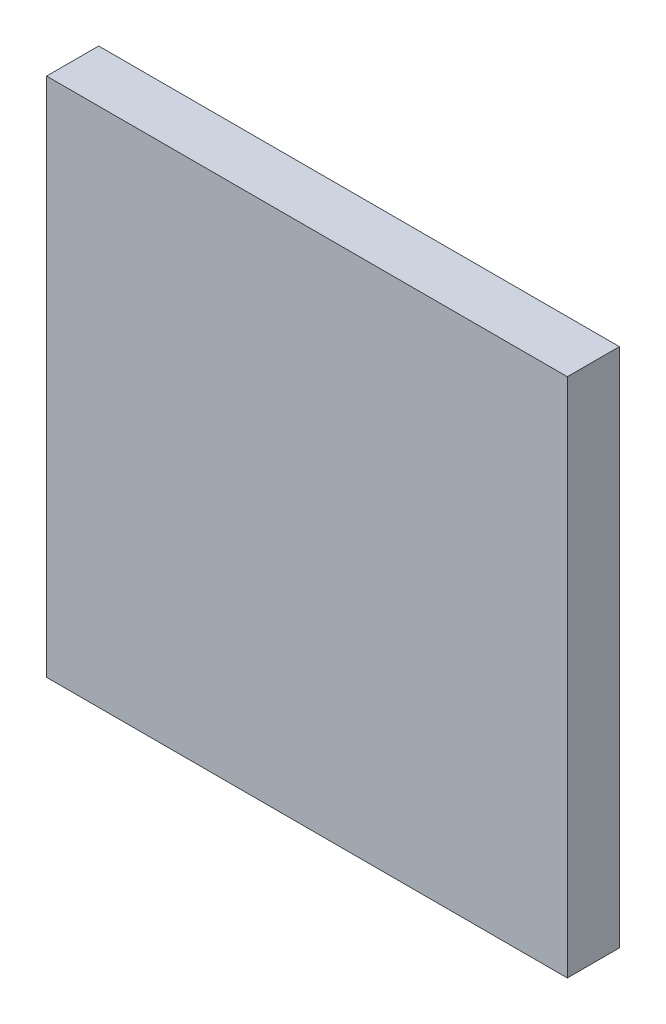
ISO-10303-21;
HEADER;
FILE_DESCRIPTION(('STEP AP214'),'2;1');
FILE_NAME('part.step','',(''),(''),'','','');
FILE_SCHEMA(('AUTOMOTIVE_DESIGN { 1 0 10303 214 1 1 1 1 }'));
ENDSEC;
DATA;
#1=APPLICATION_CONTEXT('core data for automotive mechanical design processes');
#2=APPLICATION_PROTOCOL_DEFINITION('international standard','automotive_design',2000,#1);
#3=PRODUCT_CONTEXT('',#1,'mechanical');
#4=PRODUCT('Part','Part','',(#3));
#5=PRODUCT_RELATED_PRODUCT_CATEGORY('part','',(#4));
#6=PRODUCT_DEFINITION_FORMATION('','',#4);
#7=PRODUCT_DEFINITION_CONTEXT('part definition',#1,'design');
#8=PRODUCT_DEFINITION('design','',#6,#7);
#9=PRODUCT_DEFINITION_SHAPE('','',#8);
#10=(LENGTH_UNIT() NAMED_UNIT(*) SI_UNIT(.MILLI.,.METRE.));
#11=(NAMED_UNIT(*) PLANE_ANGLE_UNIT() SI_UNIT($,.RADIAN.));
#12=(NAMED_UNIT(*) SI_UNIT($,.STERADIAN.) SOLID_ANGLE_UNIT());
#13=UNCERTAINTY_MEASURE_WITH_UNIT(LENGTH_MEASURE(1.E-05),#10,'distance_accuracy_value','');
#14=(GEOMETRIC_REPRESENTATION_CONTEXT(3) GLOBAL_UNCERTAINTY_ASSIGNED_CONTEXT((#13)) GLOBAL_UNIT_ASSIGNED_CONTEXT((#10,
#11,#12)) REPRESENTATION_CONTEXT('',''));
#15=CARTESIAN_POINT('',(0.,0.,0.));
#16=DIRECTION('',(0.,0.,1.));
#17=DIRECTION('',(1.,0.,0.));
#18=AXIS2_PLACEMENT_3D('',#15,#16,#17);
#19=CARTESIAN_POINT('',(0.,0.,60.));
#20=DIRECTION('',(0.,0.,1.));
#21=DIRECTION('',(1.,0.,0.));
#22=AXIS2_PLACEMENT_3D('',#19,#20,#21);
#23=PLANE('',#22);
#24=DIRECTION('',(-1.,0.,0.));
#25=VECTOR('',#24,1.);
#26=CARTESIAN_POINT('',(-300.,300.,60.));
#27=LINE('',#26,#25);
#28=CARTESIAN_POINT('',(300.,300.,60.));
#29=VERTEX_POINT('',#28);
#30=CARTESIAN_POINT('',(-300.,300.,60.));
#31=VERTEX_POINT('',#30);
#32=EDGE_CURVE('E11',#29,#31,#27,.T.);
#33=ORIENTED_EDGE('',*,*,#32,.T.);
#34=DIRECTION('',(0.,-1.,0.));
#35=VECTOR('',#34,1.);
#36=CARTESIAN_POINT('',(-300.,-300.,60.));
#37=LINE('',#36,#35);
#38=CARTESIAN_POINT('',(-300.,-300.,60.));
#39=VERTEX_POINT('',#38);
#40=EDGE_CURVE('E101',#31,#39,#37,.T.);
#41=ORIENTED_EDGE('',*,*,#40,.T.);
#42=DIRECTION('',(1.,0.,0.));
#43=VECTOR('',#42,1.);
#44=CARTESIAN_POINT('',(300.,-300.,60.));
#45=LINE('',#44,#43);
#46=CARTESIAN_POINT('',(300.,-300.,60.));
#47=VERTEX_POINT('',#46);
#48=EDGE_CURVE('E78',#39,#47,#45,.T.);
#49=ORIENTED_EDGE('',*,*,#48,.T.);
#50=DIRECTION('',(0.,1.,0.));
#51=VECTOR('',#50,1.);
#52=CARTESIAN_POINT('',(300.,300.,60.));
#53=LINE('',#52,#51);
#54=EDGE_CURVE('E85',#47,#29,#53,.T.);
#55=ORIENTED_EDGE('',*,*,#54,.T.);
#56=EDGE_LOOP('',(#33,#41,#49,#55));
#57=FACE_BOUND('',#56,.T.);
#58=ADVANCED_FACE('F17',(#57),#23,.T.);
#59=CARTESIAN_POINT('',(0.,0.,0.));
#60=DIRECTION('',(0.,0.,1.));
#61=DIRECTION('',(1.,0.,0.));
#62=AXIS2_PLACEMENT_3D('',#59,#60,#61);
#63=PLANE('',#62);
#64=DIRECTION('',(1.,0.,0.));
#65=VECTOR('',#64,1.);
#66=CARTESIAN_POINT('',(-300.,300.,0.));
#67=LINE('',#66,#65);
#68=CARTESIAN_POINT('',(-300.,300.,0.));
#69=VERTEX_POINT('',#68);
#70=CARTESIAN_POINT('',(300.,300.,0.));
#71=VERTEX_POINT('',#70);
#72=EDGE_CURVE('E28',#69,#71,#67,.T.);
#73=ORIENTED_EDGE('',*,*,#72,.T.);
#74=DIRECTION('',(0.,-1.,0.));
#75=VECTOR('',#74,1.);
#76=CARTESIAN_POINT('',(300.,300.,0.));
#77=LINE('',#76,#75);
#78=CARTESIAN_POINT('',(300.,-300.,0.));
#79=VERTEX_POINT('',#78);
#80=EDGE_CURVE('E84',#71,#79,#77,.T.);
#81=ORIENTED_EDGE('',*,*,#80,.T.);
#82=DIRECTION('',(-1.,0.,0.));
#83=VECTOR('',#82,1.);
#84=CARTESIAN_POINT('',(300.,-300.,0.));
#85=LINE('',#84,#83);
#86=CARTESIAN_POINT('',(-300.,-300.,0.));
#87=VERTEX_POINT('',#86);
#88=EDGE_CURVE('E67',#79,#87,#85,.T.);
#89=ORIENTED_EDGE('',*,*,#88,.T.);
#90=DIRECTION('',(0.,1.,0.));
#91=VECTOR('',#90,1.);
#92=CARTESIAN_POINT('',(-300.,-300.,0.));
#93=LINE('',#92,#91);
#94=EDGE_CURVE('E99',#87,#69,#93,.T.);
#95=ORIENTED_EDGE('',*,*,#94,.T.);
#96=EDGE_LOOP('',(#73,#81,#89,#95));
#97=FACE_BOUND('',#96,.T.);
#98=ADVANCED_FACE('F19',(#97),#63,.F.);
#99=CARTESIAN_POINT('',(300.,300.,0.));
#100=DIRECTION('',(0.,1.,0.));
#101=DIRECTION('',(1.,0.,0.));
#102=AXIS2_PLACEMENT_3D('',#99,#100,#101);
#103=PLANE('',#102);
#104=ORIENTED_EDGE('',*,*,#72,.F.);
#105=DIRECTION('',(0.,0.,1.));
#106=VECTOR('',#105,1.);
#107=CARTESIAN_POINT('',(-300.,300.,0.));
#108=LINE('',#107,#106);
#109=EDGE_CURVE('E105',#69,#31,#108,.T.);
#110=ORIENTED_EDGE('',*,*,#109,.T.);
#111=ORIENTED_EDGE('',*,*,#32,.F.);
#112=DIRECTION('',(0.,0.,1.));
#113=VECTOR('',#112,1.);
#114=CARTESIAN_POINT('',(300.,300.,0.));
#115=LINE('',#114,#113);
#116=EDGE_CURVE('E90',#71,#29,#115,.T.);
#117=ORIENTED_EDGE('',*,*,#116,.F.);
#118=EDGE_LOOP('',(#104,#110,#111,#117));
#119=FACE_BOUND('',#118,.T.);
#120=ADVANCED_FACE('F171',(#119),#103,.T.);
#121=CARTESIAN_POINT('',(-300.,300.,0.));
#122=DIRECTION('',(-1.,0.,0.));
#123=DIRECTION('',(0.,1.,0.));
#124=AXIS2_PLACEMENT_3D('',#121,#122,#123);
#125=PLANE('',#124);
#126=ORIENTED_EDGE('',*,*,#94,.F.);
#127=DIRECTION('',(0.,0.,1.));
#128=VECTOR('',#127,1.);
#129=CARTESIAN_POINT('',(-300.,-300.,0.));
#130=LINE('',#129,#128);
#131=EDGE_CURVE('E21',#87,#39,#130,.T.);
#132=ORIENTED_EDGE('',*,*,#131,.T.);
#133=ORIENTED_EDGE('',*,*,#40,.F.);
#134=ORIENTED_EDGE('',*,*,#109,.F.);
#135=EDGE_LOOP('',(#126,#132,#133,#134));
#136=FACE_BOUND('',#135,.T.);
#137=ADVANCED_FACE('F163',(#136),#125,.T.);
#138=CARTESIAN_POINT('',(-300.,-300.,0.));
#139=DIRECTION('',(0.,-1.,0.));
#140=DIRECTION('',(0.,0.,-1.));
#141=AXIS2_PLACEMENT_3D('',#138,#139,#140);
#142=PLANE('',#141);
#143=ORIENTED_EDGE('',*,*,#88,.F.);
#144=DIRECTION('',(0.,0.,1.));
#145=VECTOR('',#144,1.);
#146=CARTESIAN_POINT('',(300.,-300.,0.));
#147=LINE('',#146,#145);
#148=EDGE_CURVE('E71',#79,#47,#147,.T.);
#149=ORIENTED_EDGE('',*,*,#148,.T.);
#150=ORIENTED_EDGE('',*,*,#48,.F.);
#151=ORIENTED_EDGE('',*,*,#131,.F.);
#152=EDGE_LOOP('',(#143,#149,#150,#151));
#153=FACE_BOUND('',#152,.T.);
#154=ADVANCED_FACE('F69',(#153),#142,.T.);
#155=CARTESIAN_POINT('',(300.,-300.,0.));
#156=DIRECTION('',(1.,0.,0.));
#157=DIRECTION('',(0.,-1.,0.));
#158=AXIS2_PLACEMENT_3D('',#155,#156,#157);
#159=PLANE('',#158);
#160=ORIENTED_EDGE('',*,*,#80,.F.);
#161=ORIENTED_EDGE('',*,*,#116,.T.);
#162=ORIENTED_EDGE('',*,*,#54,.F.);
#163=ORIENTED_EDGE('',*,*,#148,.F.);
#164=EDGE_LOOP('',(#160,#161,#162,#163));
#165=FACE_BOUND('',#164,.T.);
#166=ADVANCED_FACE('F82',(#165),#159,.T.);
#167=CLOSED_SHELL('',(#58,#98,#120,#137,#154,#166));
#168=MANIFOLD_SOLID_BREP('B1',#167);
#169=ADVANCED_BREP_SHAPE_REPRESENTATION('',(#18,#168),#14);
#170=SHAPE_DEFINITION_REPRESENTATION(#9,#169);
ENDSEC;
END-ISO-10303-21;
